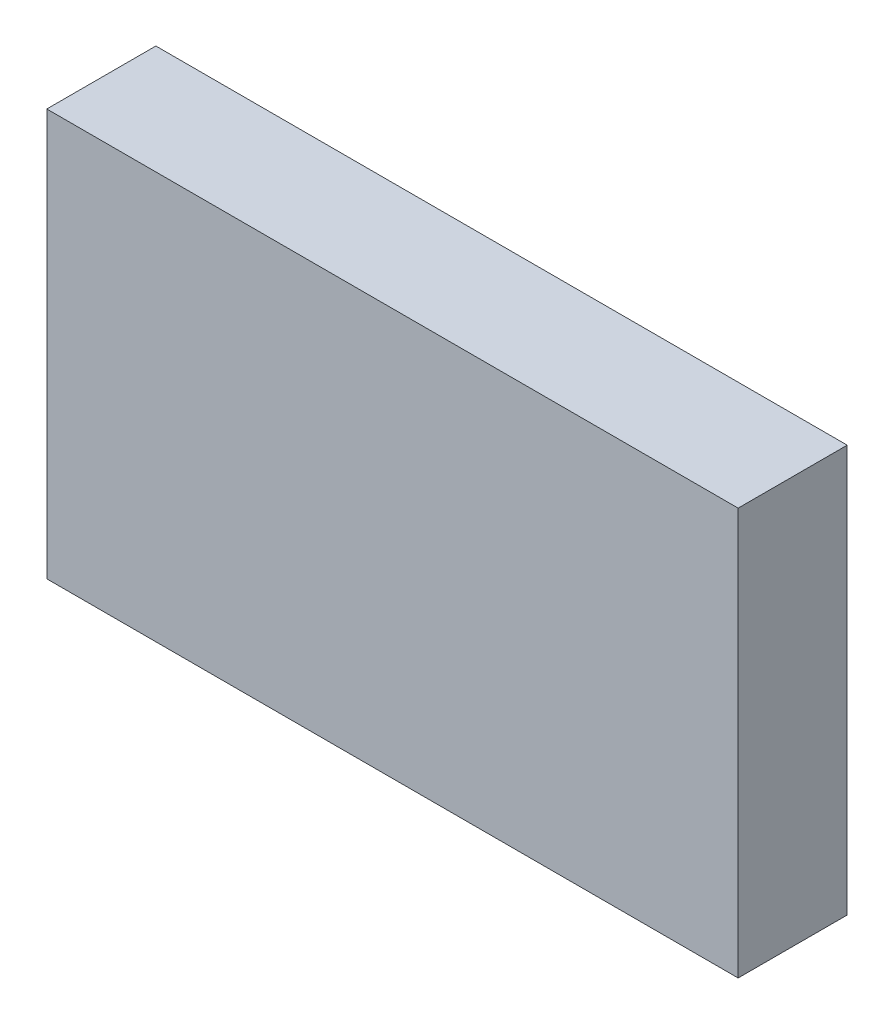
ISO-10303-21;
HEADER;
FILE_DESCRIPTION(('STEP AP214'),'2;1');
FILE_NAME('part.step','',(''),(''),'','','');
FILE_SCHEMA(('AUTOMOTIVE_DESIGN { 1 0 10303 214 1 1 1 1 }'));
ENDSEC;
DATA;
#1=APPLICATION_CONTEXT('core data for automotive mechanical design processes');
#2=APPLICATION_PROTOCOL_DEFINITION('international standard','automotive_design',2000,#1);
#3=PRODUCT_CONTEXT('',#1,'mechanical');
#4=PRODUCT('Part','Part','',(#3));
#5=PRODUCT_RELATED_PRODUCT_CATEGORY('part','',(#4));
#6=PRODUCT_DEFINITION_FORMATION('','',#4);
#7=PRODUCT_DEFINITION_CONTEXT('part definition',#1,'design');
#8=PRODUCT_DEFINITION('design','',#6,#7);
#9=PRODUCT_DEFINITION_SHAPE('','',#8);
#10=(LENGTH_UNIT() NAMED_UNIT(*) SI_UNIT(.MILLI.,.METRE.));
#11=(NAMED_UNIT(*) PLANE_ANGLE_UNIT() SI_UNIT($,.RADIAN.));
#12=(NAMED_UNIT(*) SI_UNIT($,.STERADIAN.) SOLID_ANGLE_UNIT());
#13=UNCERTAINTY_MEASURE_WITH_UNIT(LENGTH_MEASURE(1.E-05),#10,'distance_accuracy_value','');
#14=(GEOMETRIC_REPRESENTATION_CONTEXT(3) GLOBAL_UNCERTAINTY_ASSIGNED_CONTEXT((#13)) GLOBAL_UNIT_ASSIGNED_CONTEXT((#10,
#11,#12)) REPRESENTATION_CONTEXT('',''));
#15=CARTESIAN_POINT('',(0.,0.,0.));
#16=DIRECTION('',(0.,0.,1.));
#17=DIRECTION('',(1.,0.,0.));
#18=AXIS2_PLACEMENT_3D('',#15,#16,#17);
#19=CARTESIAN_POINT('',(0.,0.,10.));
#20=DIRECTION('',(1.,0.,0.));
#21=DIRECTION('',(0.,0.,-1.));
#22=AXIS2_PLACEMENT_3D('',#19,#20,#21);
#23=PLANE('',#22);
#24=DIRECTION('',(0.,-1.,0.));
#25=VECTOR('',#24,1.);
#26=CARTESIAN_POINT('',(0.,0.,0.));
#27=LINE('',#26,#25);
#28=CARTESIAN_POINT('',(0.,37.3106474783071,0.));
#29=VERTEX_POINT('',#28);
#30=CARTESIAN_POINT('',(0.,0.,0.));
#31=VERTEX_POINT('',#30);
#32=EDGE_CURVE('E96',#29,#31,#27,.T.);
#33=ORIENTED_EDGE('',*,*,#32,.T.);
#34=DIRECTION('',(0.,0.,-1.));
#35=VECTOR('',#34,1.);
#36=CARTESIAN_POINT('',(0.,0.,10.));
#37=LINE('',#36,#35);
#38=CARTESIAN_POINT('',(0.,0.,10.));
#39=VERTEX_POINT('',#38);
#40=EDGE_CURVE('E11',#39,#31,#37,.T.);
#41=ORIENTED_EDGE('',*,*,#40,.F.);
#42=DIRECTION('',(0.,-1.,0.));
#43=VECTOR('',#42,1.);
#44=CARTESIAN_POINT('',(0.,0.,10.));
#45=LINE('',#44,#43);
#46=CARTESIAN_POINT('',(0.,37.3106474783071,10.));
#47=VERTEX_POINT('',#46);
#48=EDGE_CURVE('E84',#47,#39,#45,.T.);
#49=ORIENTED_EDGE('',*,*,#48,.F.);
#50=DIRECTION('',(0.,0.,-1.));
#51=VECTOR('',#50,1.);
#52=CARTESIAN_POINT('',(0.,37.3106474783071,10.));
#53=LINE('',#52,#51);
#54=EDGE_CURVE('E92',#47,#29,#53,.T.);
#55=ORIENTED_EDGE('',*,*,#54,.T.);
#56=EDGE_LOOP('',(#33,#41,#49,#55));
#57=FACE_BOUND('',#56,.T.);
#58=ADVANCED_FACE('F33',(#57),#23,.F.);
#59=CARTESIAN_POINT('',(0.,0.,10.));
#60=DIRECTION('',(0.,1.,0.));
#61=DIRECTION('',(0.,0.,1.));
#62=AXIS2_PLACEMENT_3D('',#59,#60,#61);
#63=PLANE('',#62);
#64=DIRECTION('',(1.,0.,0.));
#65=VECTOR('',#64,1.);
#66=CARTESIAN_POINT('',(0.,0.,0.));
#67=LINE('',#66,#65);
#68=CARTESIAN_POINT('',(63.3898063387619,0.,0.));
#69=VERTEX_POINT('',#68);
#70=EDGE_CURVE('E88',#31,#69,#67,.T.);
#71=ORIENTED_EDGE('',*,*,#70,.T.);
#72=DIRECTION('',(0.,0.,-1.));
#73=VECTOR('',#72,1.);
#74=CARTESIAN_POINT('',(63.3898063387619,0.,10.));
#75=LINE('',#74,#73);
#76=CARTESIAN_POINT('',(63.3898063387619,0.,10.));
#77=VERTEX_POINT('',#76);
#78=EDGE_CURVE('E41',#77,#69,#75,.T.);
#79=ORIENTED_EDGE('',*,*,#78,.F.);
#80=DIRECTION('',(1.,0.,0.));
#81=VECTOR('',#80,1.);
#82=CARTESIAN_POINT('',(0.,0.,10.));
#83=LINE('',#82,#81);
#84=EDGE_CURVE('E79',#39,#77,#83,.T.);
#85=ORIENTED_EDGE('',*,*,#84,.F.);
#86=ORIENTED_EDGE('',*,*,#40,.T.);
#87=EDGE_LOOP('',(#71,#79,#85,#86));
#88=FACE_BOUND('',#87,.T.);
#89=ADVANCED_FACE('F87',(#88),#63,.F.);
#90=CARTESIAN_POINT('',(63.3898063387619,0.,10.));
#91=DIRECTION('',(-1.,0.,0.));
#92=DIRECTION('',(0.,0.,1.));
#93=AXIS2_PLACEMENT_3D('',#90,#91,#92);
#94=PLANE('',#93);
#95=DIRECTION('',(0.,1.,0.));
#96=VECTOR('',#95,1.);
#97=CARTESIAN_POINT('',(63.3898063387619,0.,0.));
#98=LINE('',#97,#96);
#99=CARTESIAN_POINT('',(63.3898063387619,37.3106474783071,0.));
#100=VERTEX_POINT('',#99);
#101=EDGE_CURVE('E66',#69,#100,#98,.T.);
#102=ORIENTED_EDGE('',*,*,#101,.T.);
#103=DIRECTION('',(0.,0.,-1.));
#104=VECTOR('',#103,1.);
#105=CARTESIAN_POINT('',(63.3898063387619,37.3106474783071,10.));
#106=LINE('',#105,#104);
#107=CARTESIAN_POINT('',(63.3898063387619,37.3106474783071,10.));
#108=VERTEX_POINT('',#107);
#109=EDGE_CURVE('E89',#108,#100,#106,.T.);
#110=ORIENTED_EDGE('',*,*,#109,.F.);
#111=DIRECTION('',(0.,1.,0.));
#112=VECTOR('',#111,1.);
#113=CARTESIAN_POINT('',(63.3898063387619,0.,10.));
#114=LINE('',#113,#112);
#115=EDGE_CURVE('E82',#77,#108,#114,.T.);
#116=ORIENTED_EDGE('',*,*,#115,.F.);
#117=ORIENTED_EDGE('',*,*,#78,.T.);
#118=EDGE_LOOP('',(#102,#110,#116,#117));
#119=FACE_BOUND('',#118,.T.);
#120=ADVANCED_FACE('F90',(#119),#94,.F.);
#121=CARTESIAN_POINT('',(0.,37.3106474783071,10.));
#122=DIRECTION('',(0.,-1.,0.));
#123=DIRECTION('',(0.,0.,-1.));
#124=AXIS2_PLACEMENT_3D('',#121,#122,#123);
#125=PLANE('',#124);
#126=DIRECTION('',(-1.,0.,0.));
#127=VECTOR('',#126,1.);
#128=CARTESIAN_POINT('',(0.,37.3106474783071,0.));
#129=LINE('',#128,#127);
#130=EDGE_CURVE('E72',#100,#29,#129,.T.);
#131=ORIENTED_EDGE('',*,*,#130,.T.);
#132=ORIENTED_EDGE('',*,*,#54,.F.);
#133=DIRECTION('',(-1.,0.,0.));
#134=VECTOR('',#133,1.);
#135=CARTESIAN_POINT('',(0.,37.3106474783071,10.));
#136=LINE('',#135,#134);
#137=EDGE_CURVE('E49',#108,#47,#136,.T.);
#138=ORIENTED_EDGE('',*,*,#137,.F.);
#139=ORIENTED_EDGE('',*,*,#109,.T.);
#140=EDGE_LOOP('',(#131,#132,#138,#139));
#141=FACE_BOUND('',#140,.T.);
#142=ADVANCED_FACE('F103',(#141),#125,.F.);
#143=CARTESIAN_POINT('',(0.,37.3106474783071,10.));
#144=DIRECTION('',(0.,0.,-1.));
#145=DIRECTION('',(-1.,0.,0.));
#146=AXIS2_PLACEMENT_3D('',#143,#144,#145);
#147=PLANE('',#146);
#148=ORIENTED_EDGE('',*,*,#48,.T.);
#149=ORIENTED_EDGE('',*,*,#84,.T.);
#150=ORIENTED_EDGE('',*,*,#115,.T.);
#151=ORIENTED_EDGE('',*,*,#137,.T.);
#152=EDGE_LOOP('',(#148,#149,#150,#151));
#153=FACE_BOUND('',#152,.T.);
#154=ADVANCED_FACE('F80',(#153),#147,.F.);
#155=CARTESIAN_POINT('',(0.,37.3106474783071,0.));
#156=DIRECTION('',(0.,0.,-1.));
#157=DIRECTION('',(-1.,0.,0.));
#158=AXIS2_PLACEMENT_3D('',#155,#156,#157);
#159=PLANE('',#158);
#160=ORIENTED_EDGE('',*,*,#32,.F.);
#161=ORIENTED_EDGE('',*,*,#130,.F.);
#162=ORIENTED_EDGE('',*,*,#101,.F.);
#163=ORIENTED_EDGE('',*,*,#70,.F.);
#164=EDGE_LOOP('',(#160,#161,#162,#163));
#165=FACE_BOUND('',#164,.T.);
#166=ADVANCED_FACE('F106',(#165),#159,.T.);
#167=CLOSED_SHELL('',(#58,#89,#120,#142,#154,#166));
#168=MANIFOLD_SOLID_BREP('B2',#167);
#169=ADVANCED_BREP_SHAPE_REPRESENTATION('',(#18,#168),#14);
#170=SHAPE_DEFINITION_REPRESENTATION(#9,#169);
ENDSEC;
END-ISO-10303-21;
